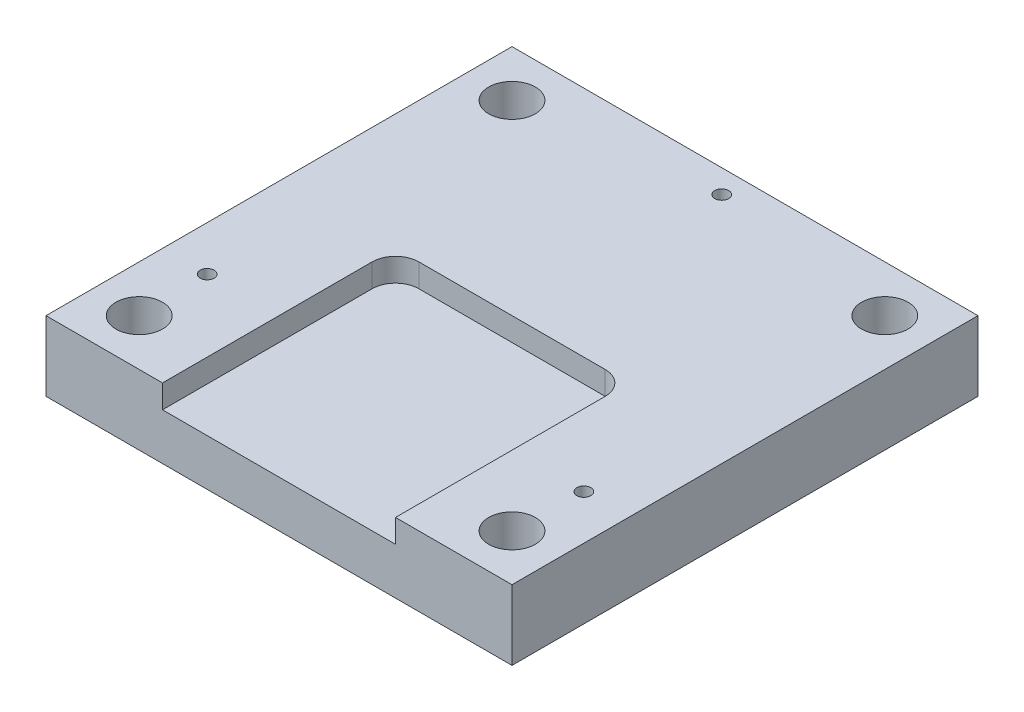
ISO-10303-21;
HEADER;
FILE_DESCRIPTION(('STEP AP214'),'2;1');
FILE_NAME('part.step','',(''),(''),'','','');
FILE_SCHEMA(('AUTOMOTIVE_DESIGN { 1 0 10303 214 1 1 1 1 }'));
ENDSEC;
DATA;
#1=APPLICATION_CONTEXT('core data for automotive mechanical design processes');
#2=APPLICATION_PROTOCOL_DEFINITION('international standard','automotive_design',2000,#1);
#3=PRODUCT_CONTEXT('',#1,'mechanical');
#4=PRODUCT('Part','Part','',(#3));
#5=PRODUCT_RELATED_PRODUCT_CATEGORY('part','',(#4));
#6=PRODUCT_DEFINITION_FORMATION('','',#4);
#7=PRODUCT_DEFINITION_CONTEXT('part definition',#1,'design');
#8=PRODUCT_DEFINITION('design','',#6,#7);
#9=PRODUCT_DEFINITION_SHAPE('','',#8);
#10=(LENGTH_UNIT() NAMED_UNIT(*) SI_UNIT(.MILLI.,.METRE.));
#11=(NAMED_UNIT(*) PLANE_ANGLE_UNIT() SI_UNIT($,.RADIAN.));
#12=(NAMED_UNIT(*) SI_UNIT($,.STERADIAN.) SOLID_ANGLE_UNIT());
#13=UNCERTAINTY_MEASURE_WITH_UNIT(LENGTH_MEASURE(1.E-05),#10,'distance_accuracy_value','');
#14=(GEOMETRIC_REPRESENTATION_CONTEXT(3) GLOBAL_UNCERTAINTY_ASSIGNED_CONTEXT((#13)) GLOBAL_UNIT_ASSIGNED_CONTEXT((#10,
#11,#12)) REPRESENTATION_CONTEXT('',''));
#15=CARTESIAN_POINT('',(0.,0.,0.));
#16=DIRECTION('',(0.,0.,1.));
#17=DIRECTION('',(1.,0.,0.));
#18=AXIS2_PLACEMENT_3D('',#15,#16,#17);
#19=CARTESIAN_POINT('',(0.,15.,0.));
#20=DIRECTION('',(1.,0.,0.));
#21=DIRECTION('',(0.,0.,-1.));
#22=AXIS2_PLACEMENT_3D('',#19,#20,#21);
#23=PLANE('',#22);
#24=DIRECTION('',(0.,0.,1.));
#25=VECTOR('',#24,1.);
#26=CARTESIAN_POINT('',(0.,0.,0.));
#27=LINE('',#26,#25);
#28=CARTESIAN_POINT('',(0.,0.,0.));
#29=VERTEX_POINT('',#28);
#30=CARTESIAN_POINT('',(0.,0.,100.));
#31=VERTEX_POINT('',#30);
#32=EDGE_CURVE('E149',#29,#31,#27,.T.);
#33=ORIENTED_EDGE('',*,*,#32,.T.);
#34=DIRECTION('',(0.,-1.,0.));
#35=VECTOR('',#34,1.);
#36=CARTESIAN_POINT('',(0.,15.,100.));
#37=LINE('',#36,#35);
#38=CARTESIAN_POINT('',(0.,15.,100.));
#39=VERTEX_POINT('',#38);
#40=EDGE_CURVE('E191',#39,#31,#37,.T.);
#41=ORIENTED_EDGE('',*,*,#40,.F.);
#42=DIRECTION('',(0.,0.,1.));
#43=VECTOR('',#42,1.);
#44=CARTESIAN_POINT('',(0.,15.,0.));
#45=LINE('',#44,#43);
#46=CARTESIAN_POINT('',(0.,15.,0.));
#47=VERTEX_POINT('',#46);
#48=EDGE_CURVE('E164',#47,#39,#45,.T.);
#49=ORIENTED_EDGE('',*,*,#48,.F.);
#50=DIRECTION('',(0.,-1.,0.));
#51=VECTOR('',#50,1.);
#52=CARTESIAN_POINT('',(0.,15.,0.));
#53=LINE('',#52,#51);
#54=EDGE_CURVE('E175',#47,#29,#53,.T.);
#55=ORIENTED_EDGE('',*,*,#54,.T.);
#56=EDGE_LOOP('',(#33,#41,#49,#55));
#57=FACE_BOUND('',#56,.T.);
#58=ADVANCED_FACE('F34',(#57),#23,.F.);
#59=CARTESIAN_POINT('',(0.,15.,100.));
#60=DIRECTION('',(0.,0.,-1.));
#61=DIRECTION('',(-1.,0.,0.));
#62=AXIS2_PLACEMENT_3D('',#59,#60,#61);
#63=PLANE('',#62);
#64=DIRECTION('',(1.,0.,0.));
#65=VECTOR('',#64,1.);
#66=CARTESIAN_POINT('',(25.,10.,100.));
#67=LINE('',#66,#65);
#68=CARTESIAN_POINT('',(25.,10.,100.));
#69=VERTEX_POINT('',#68);
#70=CARTESIAN_POINT('',(75.,10.,100.));
#71=VERTEX_POINT('',#70);
#72=EDGE_CURVE('E114',#69,#71,#67,.T.);
#73=ORIENTED_EDGE('',*,*,#72,.F.);
#74=DIRECTION('',(0.,1.,0.));
#75=VECTOR('',#74,1.);
#76=CARTESIAN_POINT('',(25.,10.,100.));
#77=LINE('',#76,#75);
#78=CARTESIAN_POINT('',(25.,15.,100.));
#79=VERTEX_POINT('',#78);
#80=EDGE_CURVE('E120',#69,#79,#77,.T.);
#81=ORIENTED_EDGE('',*,*,#80,.T.);
#82=DIRECTION('',(1.,0.,0.));
#83=VECTOR('',#82,1.);
#84=CARTESIAN_POINT('',(0.,15.,100.));
#85=LINE('',#84,#83);
#86=EDGE_CURVE('E169',#39,#79,#85,.T.);
#87=ORIENTED_EDGE('',*,*,#86,.F.);
#88=ORIENTED_EDGE('',*,*,#40,.T.);
#89=DIRECTION('',(1.,0.,0.));
#90=VECTOR('',#89,1.);
#91=CARTESIAN_POINT('',(0.,0.,100.));
#92=LINE('',#91,#90);
#93=CARTESIAN_POINT('',(100.,0.,100.));
#94=VERTEX_POINT('',#93);
#95=EDGE_CURVE('E178',#31,#94,#92,.T.);
#96=ORIENTED_EDGE('',*,*,#95,.T.);
#97=DIRECTION('',(0.,-1.,0.));
#98=VECTOR('',#97,1.);
#99=CARTESIAN_POINT('',(100.,15.,100.));
#100=LINE('',#99,#98);
#101=CARTESIAN_POINT('',(100.,15.,100.));
#102=VERTEX_POINT('',#101);
#103=EDGE_CURVE('E188',#102,#94,#100,.T.);
#104=ORIENTED_EDGE('',*,*,#103,.F.);
#105=CARTESIAN_POINT('',(75.,15.,100.));
#106=VERTEX_POINT('',#105);
#107=EDGE_CURVE('E167',#106,#102,#85,.T.);
#108=ORIENTED_EDGE('',*,*,#107,.F.);
#109=DIRECTION('',(0.,1.,0.));
#110=VECTOR('',#109,1.);
#111=CARTESIAN_POINT('',(75.,10.,100.));
#112=LINE('',#111,#110);
#113=EDGE_CURVE('E126',#71,#106,#112,.T.);
#114=ORIENTED_EDGE('',*,*,#113,.F.);
#115=EDGE_LOOP('',(#73,#81,#87,#88,#96,#104,#108,#114));
#116=FACE_BOUND('',#115,.T.);
#117=ADVANCED_FACE('F129',(#116),#63,.F.);
#118=CARTESIAN_POINT('',(100.,15.,0.));
#119=DIRECTION('',(-1.,0.,0.));
#120=DIRECTION('',(0.,0.,1.));
#121=AXIS2_PLACEMENT_3D('',#118,#119,#120);
#122=PLANE('',#121);
#123=DIRECTION('',(0.,0.,-1.));
#124=VECTOR('',#123,1.);
#125=CARTESIAN_POINT('',(100.,0.,0.));
#126=LINE('',#125,#124);
#127=CARTESIAN_POINT('',(100.,0.,0.));
#128=VERTEX_POINT('',#127);
#129=EDGE_CURVE('E180',#94,#128,#126,.T.);
#130=ORIENTED_EDGE('',*,*,#129,.T.);
#131=DIRECTION('',(0.,-1.,0.));
#132=VECTOR('',#131,1.);
#133=CARTESIAN_POINT('',(100.,15.,0.));
#134=LINE('',#133,#132);
#135=CARTESIAN_POINT('',(100.,15.,0.));
#136=VERTEX_POINT('',#135);
#137=EDGE_CURVE('E185',#136,#128,#134,.T.);
#138=ORIENTED_EDGE('',*,*,#137,.F.);
#139=DIRECTION('',(0.,0.,-1.));
#140=VECTOR('',#139,1.);
#141=CARTESIAN_POINT('',(100.,15.,0.));
#142=LINE('',#141,#140);
#143=EDGE_CURVE('E171',#102,#136,#142,.T.);
#144=ORIENTED_EDGE('',*,*,#143,.F.);
#145=ORIENTED_EDGE('',*,*,#103,.T.);
#146=EDGE_LOOP('',(#130,#138,#144,#145));
#147=FACE_BOUND('',#146,.T.);
#148=ADVANCED_FACE('F232',(#147),#122,.F.);
#149=CARTESIAN_POINT('',(0.,15.,0.));
#150=DIRECTION('',(0.,0.,1.));
#151=DIRECTION('',(1.,0.,0.));
#152=AXIS2_PLACEMENT_3D('',#149,#150,#151);
#153=PLANE('',#152);
#154=DIRECTION('',(-1.,0.,0.));
#155=VECTOR('',#154,1.);
#156=CARTESIAN_POINT('',(0.,0.,0.));
#157=LINE('',#156,#155);
#158=EDGE_CURVE('E168',#128,#29,#157,.T.);
#159=ORIENTED_EDGE('',*,*,#158,.T.);
#160=ORIENTED_EDGE('',*,*,#54,.F.);
#161=DIRECTION('',(-1.,0.,0.));
#162=VECTOR('',#161,1.);
#163=CARTESIAN_POINT('',(0.,15.,0.));
#164=LINE('',#163,#162);
#165=EDGE_CURVE('E173',#136,#47,#164,.T.);
#166=ORIENTED_EDGE('',*,*,#165,.F.);
#167=ORIENTED_EDGE('',*,*,#137,.T.);
#168=EDGE_LOOP('',(#159,#160,#166,#167));
#169=FACE_BOUND('',#168,.T.);
#170=ADVANCED_FACE('F236',(#169),#153,.F.);
#171=CARTESIAN_POINT('',(0.,15.,0.));
#172=DIRECTION('',(0.,1.,0.));
#173=DIRECTION('',(0.,0.,1.));
#174=AXIS2_PLACEMENT_3D('',#171,#172,#173);
#175=PLANE('',#174);
#176=CARTESIAN_POINT('',(90.,15.,9.99999999999996));
#177=DIRECTION('',(0.,1.,0.));
#178=DIRECTION('',(0.,0.,1.));
#179=AXIS2_PLACEMENT_3D('',#176,#177,#178);
#180=CIRCLE('',#179,5.);
#181=CARTESIAN_POINT('',(90.,15.,15.));
#182=VERTEX_POINT('',#181);
#183=EDGE_CURVE('E472',#182,#182,#180,.T.);
#184=ORIENTED_EDGE('',*,*,#183,.F.);
#185=EDGE_LOOP('',(#184));
#186=FACE_BOUND('',#185,.T.);
#187=CARTESIAN_POINT('',(9.99999999999999,15.,90.));
#188=DIRECTION('',(0.,1.,0.));
#189=DIRECTION('',(0.,0.,1.));
#190=AXIS2_PLACEMENT_3D('',#187,#188,#189);
#191=CIRCLE('',#190,5.);
#192=CARTESIAN_POINT('',(9.99999999999999,15.,95.));
#193=VERTEX_POINT('',#192);
#194=EDGE_CURVE('E460',#193,#193,#191,.T.);
#195=ORIENTED_EDGE('',*,*,#194,.F.);
#196=EDGE_LOOP('',(#195));
#197=FACE_BOUND('',#196,.T.);
#198=CARTESIAN_POINT('',(90.,15.,90.));
#199=DIRECTION('',(0.,1.,0.));
#200=DIRECTION('',(0.,0.,1.));
#201=AXIS2_PLACEMENT_3D('',#198,#199,#200);
#202=CIRCLE('',#201,5.00000000000001);
#203=CARTESIAN_POINT('',(90.,15.,95.));
#204=VERTEX_POINT('',#203);
#205=EDGE_CURVE('E461',#204,#204,#202,.T.);
#206=ORIENTED_EDGE('',*,*,#205,.F.);
#207=EDGE_LOOP('',(#206));
#208=FACE_BOUND('',#207,.T.);
#209=CARTESIAN_POINT('',(9.99999999999996,15.,10.));
#210=DIRECTION('',(0.,1.,0.));
#211=DIRECTION('',(0.,0.,1.));
#212=AXIS2_PLACEMENT_3D('',#209,#210,#211);
#213=CIRCLE('',#212,5.);
#214=CARTESIAN_POINT('',(9.99999999999996,15.,15.));
#215=VERTEX_POINT('',#214);
#216=EDGE_CURVE('E471',#215,#215,#213,.T.);
#217=ORIENTED_EDGE('',*,*,#216,.F.);
#218=EDGE_LOOP('',(#217));
#219=FACE_BOUND('',#218,.T.);
#220=DIRECTION('',(0.,0.,1.));
#221=VECTOR('',#220,1.);
#222=CARTESIAN_POINT('',(25.,15.,50.));
#223=LINE('',#222,#221);
#224=CARTESIAN_POINT('',(25.,15.,55.));
#225=VERTEX_POINT('',#224);
#226=EDGE_CURVE('E123',#225,#79,#223,.T.);
#227=ORIENTED_EDGE('',*,*,#226,.F.);
#228=CARTESIAN_POINT('',(30.,15.,55.));
#229=DIRECTION('',(0.,1.,0.));
#230=DIRECTION('',(0.,0.,1.));
#231=AXIS2_PLACEMENT_3D('',#228,#229,#230);
#232=CIRCLE('',#231,5.);
#233=CARTESIAN_POINT('',(30.,15.,50.));
#234=VERTEX_POINT('',#233);
#235=EDGE_CURVE('E11',#225,#234,#232,.F.);
#236=ORIENTED_EDGE('',*,*,#235,.T.);
#237=DIRECTION('',(-1.,0.,0.));
#238=VECTOR('',#237,1.);
#239=CARTESIAN_POINT('',(25.,15.,50.));
#240=LINE('',#239,#238);
#241=CARTESIAN_POINT('',(70.,15.,50.));
#242=VERTEX_POINT('',#241);
#243=EDGE_CURVE('E117',#242,#234,#240,.T.);
#244=ORIENTED_EDGE('',*,*,#243,.F.);
#245=CARTESIAN_POINT('',(70.,15.,55.));
#246=DIRECTION('',(0.,1.,0.));
#247=DIRECTION('',(0.,0.,1.));
#248=AXIS2_PLACEMENT_3D('',#245,#246,#247);
#249=CIRCLE('',#248,5.);
#250=CARTESIAN_POINT('',(75.,15.,55.));
#251=VERTEX_POINT('',#250);
#252=EDGE_CURVE('E42',#242,#251,#249,.F.);
#253=ORIENTED_EDGE('',*,*,#252,.T.);
#254=DIRECTION('',(0.,0.,-1.));
#255=VECTOR('',#254,1.);
#256=CARTESIAN_POINT('',(75.,15.,50.));
#257=LINE('',#256,#255);
#258=EDGE_CURVE('E138',#106,#251,#257,.T.);
#259=ORIENTED_EDGE('',*,*,#258,.F.);
#260=ORIENTED_EDGE('',*,*,#107,.T.);
#261=ORIENTED_EDGE('',*,*,#143,.T.);
#262=ORIENTED_EDGE('',*,*,#165,.T.);
#263=ORIENTED_EDGE('',*,*,#48,.T.);
#264=ORIENTED_EDGE('',*,*,#86,.T.);
#265=EDGE_LOOP('',(#227,#236,#244,#253,#259,#260,#261,#262,#263,#264));
#266=FACE_BOUND('',#265,.T.);
#267=CARTESIAN_POINT('',(50.,15.,5.));
#268=DIRECTION('',(0.,1.,0.));
#269=DIRECTION('',(0.,0.,1.));
#270=AXIS2_PLACEMENT_3D('',#267,#268,#269);
#271=CIRCLE('',#270,1.5);
#272=CARTESIAN_POINT('',(50.,15.,6.50000000000001));
#273=VERTEX_POINT('',#272);
#274=EDGE_CURVE('E150',#273,#273,#271,.T.);
#275=ORIENTED_EDGE('',*,*,#274,.F.);
#276=EDGE_LOOP('',(#275));
#277=FACE_BOUND('',#276,.T.);
#278=CARTESIAN_POINT('',(9.5854811567262,15.,75.));
#279=DIRECTION('',(0.,1.,0.));
#280=DIRECTION('',(0.,0.,1.));
#281=AXIS2_PLACEMENT_3D('',#278,#279,#280);
#282=CIRCLE('',#281,1.5);
#283=CARTESIAN_POINT('',(9.5854811567262,15.,76.5));
#284=VERTEX_POINT('',#283);
#285=EDGE_CURVE('E156',#284,#284,#282,.T.);
#286=ORIENTED_EDGE('',*,*,#285,.F.);
#287=EDGE_LOOP('',(#286));
#288=FACE_BOUND('',#287,.T.);
#289=CARTESIAN_POINT('',(90.4145188432738,15.,75.));
#290=DIRECTION('',(0.,1.,0.));
#291=DIRECTION('',(0.,0.,1.));
#292=AXIS2_PLACEMENT_3D('',#289,#290,#291);
#293=CIRCLE('',#292,1.5);
#294=CARTESIAN_POINT('',(90.4145188432738,15.,76.5));
#295=VERTEX_POINT('',#294);
#296=EDGE_CURVE('E144',#295,#295,#293,.T.);
#297=ORIENTED_EDGE('',*,*,#296,.F.);
#298=EDGE_LOOP('',(#297));
#299=FACE_BOUND('',#298,.T.);
#300=ADVANCED_FACE('F208',(#186,#197,#208,#219,#266,#277,#288,#299),#175,.T.);
#301=CARTESIAN_POINT('',(0.,0.,0.));
#302=DIRECTION('',(0.,1.,0.));
#303=DIRECTION('',(0.,0.,1.));
#304=AXIS2_PLACEMENT_3D('',#301,#302,#303);
#305=PLANE('',#304);
#306=CARTESIAN_POINT('',(50.,0.,5.));
#307=DIRECTION('',(0.,1.,0.));
#308=DIRECTION('',(0.,0.,1.));
#309=AXIS2_PLACEMENT_3D('',#306,#307,#308);
#310=CIRCLE('',#309,1.5);
#311=CARTESIAN_POINT('',(50.,0.,6.50000000000001));
#312=VERTEX_POINT('',#311);
#313=EDGE_CURVE('E146',#312,#312,#310,.T.);
#314=ORIENTED_EDGE('',*,*,#313,.T.);
#315=EDGE_LOOP('',(#314));
#316=FACE_BOUND('',#315,.T.);
#317=CARTESIAN_POINT('',(9.5854811567262,0.,75.));
#318=DIRECTION('',(0.,1.,0.));
#319=DIRECTION('',(0.,0.,1.));
#320=AXIS2_PLACEMENT_3D('',#317,#318,#319);
#321=CIRCLE('',#320,1.5);
#322=CARTESIAN_POINT('',(9.5854811567262,0.,76.5));
#323=VERTEX_POINT('',#322);
#324=EDGE_CURVE('E153',#323,#323,#321,.T.);
#325=ORIENTED_EDGE('',*,*,#324,.T.);
#326=EDGE_LOOP('',(#325));
#327=FACE_BOUND('',#326,.T.);
#328=CARTESIAN_POINT('',(90.4145188432738,0.,75.));
#329=DIRECTION('',(0.,1.,0.));
#330=DIRECTION('',(0.,0.,1.));
#331=AXIS2_PLACEMENT_3D('',#328,#329,#330);
#332=CIRCLE('',#331,1.5);
#333=CARTESIAN_POINT('',(90.4145188432738,0.,76.5));
#334=VERTEX_POINT('',#333);
#335=EDGE_CURVE('E159',#334,#334,#332,.T.);
#336=ORIENTED_EDGE('',*,*,#335,.T.);
#337=EDGE_LOOP('',(#336));
#338=FACE_BOUND('',#337,.T.);
#339=ORIENTED_EDGE('',*,*,#32,.F.);
#340=ORIENTED_EDGE('',*,*,#158,.F.);
#341=ORIENTED_EDGE('',*,*,#129,.F.);
#342=ORIENTED_EDGE('',*,*,#95,.F.);
#343=EDGE_LOOP('',(#339,#340,#341,#342));
#344=FACE_BOUND('',#343,.T.);
#345=ADVANCED_FACE('F228',(#316,#327,#338,#344),#305,.F.);
#346=CARTESIAN_POINT('',(90.4145188432738,0.,75.));
#347=DIRECTION('',(0.,1.,0.));
#348=DIRECTION('',(0.,0.,1.));
#349=AXIS2_PLACEMENT_3D('',#346,#347,#348);
#350=CYLINDRICAL_SURFACE('',#349,1.5);
#351=ORIENTED_EDGE('',*,*,#335,.F.);
#352=EDGE_LOOP('',(#351));
#353=FACE_BOUND('',#352,.T.);
#354=ORIENTED_EDGE('',*,*,#296,.T.);
#355=EDGE_LOOP('',(#354));
#356=FACE_BOUND('',#355,.T.);
#357=ADVANCED_FACE('F304',(#353,#356),#350,.F.);
#358=CARTESIAN_POINT('',(9.5854811567262,0.,75.));
#359=DIRECTION('',(0.,1.,0.));
#360=DIRECTION('',(0.,0.,1.));
#361=AXIS2_PLACEMENT_3D('',#358,#359,#360);
#362=CYLINDRICAL_SURFACE('',#361,1.5);
#363=ORIENTED_EDGE('',*,*,#324,.F.);
#364=EDGE_LOOP('',(#363));
#365=FACE_BOUND('',#364,.T.);
#366=ORIENTED_EDGE('',*,*,#285,.T.);
#367=EDGE_LOOP('',(#366));
#368=FACE_BOUND('',#367,.T.);
#369=ADVANCED_FACE('F300',(#365,#368),#362,.F.);
#370=CARTESIAN_POINT('',(50.,0.,5.));
#371=DIRECTION('',(0.,1.,0.));
#372=DIRECTION('',(0.,0.,1.));
#373=AXIS2_PLACEMENT_3D('',#370,#371,#372);
#374=CYLINDRICAL_SURFACE('',#373,1.5);
#375=ORIENTED_EDGE('',*,*,#313,.F.);
#376=EDGE_LOOP('',(#375));
#377=FACE_BOUND('',#376,.T.);
#378=ORIENTED_EDGE('',*,*,#274,.T.);
#379=EDGE_LOOP('',(#378));
#380=FACE_BOUND('',#379,.T.);
#381=ADVANCED_FACE('F297',(#377,#380),#374,.F.);
#382=CARTESIAN_POINT('',(25.,10.,50.));
#383=DIRECTION('',(-1.,0.,0.));
#384=DIRECTION('',(0.,0.,1.));
#385=AXIS2_PLACEMENT_3D('',#382,#383,#384);
#386=PLANE('',#385);
#387=DIRECTION('',(0.,0.,1.));
#388=VECTOR('',#387,1.);
#389=CARTESIAN_POINT('',(25.,10.,50.));
#390=LINE('',#389,#388);
#391=CARTESIAN_POINT('',(25.,10.,55.));
#392=VERTEX_POINT('',#391);
#393=EDGE_CURVE('E109',#392,#69,#390,.T.);
#394=ORIENTED_EDGE('',*,*,#393,.F.);
#395=DIRECTION('',(0.,1.,0.));
#396=VECTOR('',#395,1.);
#397=CARTESIAN_POINT('',(25.,15.,55.));
#398=LINE('',#397,#396);
#399=EDGE_CURVE('E204',#392,#225,#398,.T.);
#400=ORIENTED_EDGE('',*,*,#399,.T.);
#401=ORIENTED_EDGE('',*,*,#226,.T.);
#402=ORIENTED_EDGE('',*,*,#80,.F.);
#403=EDGE_LOOP('',(#394,#400,#401,#402));
#404=FACE_BOUND('',#403,.T.);
#405=ADVANCED_FACE('F121',(#404),#386,.F.);
#406=CARTESIAN_POINT('',(25.,10.,50.));
#407=DIRECTION('',(0.,0.,-1.));
#408=DIRECTION('',(-1.,0.,0.));
#409=AXIS2_PLACEMENT_3D('',#406,#407,#408);
#410=PLANE('',#409);
#411=DIRECTION('',(-1.,0.,0.));
#412=VECTOR('',#411,1.);
#413=CARTESIAN_POINT('',(25.,10.,50.));
#414=LINE('',#413,#412);
#415=CARTESIAN_POINT('',(70.,10.,50.));
#416=VERTEX_POINT('',#415);
#417=CARTESIAN_POINT('',(30.,10.,50.));
#418=VERTEX_POINT('',#417);
#419=EDGE_CURVE('E127',#416,#418,#414,.T.);
#420=ORIENTED_EDGE('',*,*,#419,.F.);
#421=DIRECTION('',(0.,1.,0.));
#422=VECTOR('',#421,1.);
#423=CARTESIAN_POINT('',(70.,15.,50.));
#424=LINE('',#423,#422);
#425=EDGE_CURVE('E196',#416,#242,#424,.T.);
#426=ORIENTED_EDGE('',*,*,#425,.T.);
#427=ORIENTED_EDGE('',*,*,#243,.T.);
#428=DIRECTION('',(0.,1.,0.));
#429=VECTOR('',#428,1.);
#430=CARTESIAN_POINT('',(30.,10.,50.));
#431=LINE('',#430,#429);
#432=EDGE_CURVE('E194',#234,#418,#431,.F.);
#433=ORIENTED_EDGE('',*,*,#432,.T.);
#434=EDGE_LOOP('',(#420,#426,#427,#433));
#435=FACE_BOUND('',#434,.T.);
#436=ADVANCED_FACE('F219',(#435),#410,.F.);
#437=CARTESIAN_POINT('',(75.,10.,50.));
#438=DIRECTION('',(1.,0.,0.));
#439=DIRECTION('',(0.,0.,-1.));
#440=AXIS2_PLACEMENT_3D('',#437,#438,#439);
#441=PLANE('',#440);
#442=ORIENTED_EDGE('',*,*,#258,.T.);
#443=DIRECTION('',(0.,1.,0.));
#444=VECTOR('',#443,1.);
#445=CARTESIAN_POINT('',(75.,10.,55.));
#446=LINE('',#445,#444);
#447=CARTESIAN_POINT('',(75.,10.,55.));
#448=VERTEX_POINT('',#447);
#449=EDGE_CURVE('E199',#251,#448,#446,.F.);
#450=ORIENTED_EDGE('',*,*,#449,.T.);
#451=DIRECTION('',(0.,0.,-1.));
#452=VECTOR('',#451,1.);
#453=CARTESIAN_POINT('',(75.,10.,50.));
#454=LINE('',#453,#452);
#455=EDGE_CURVE('E131',#71,#448,#454,.T.);
#456=ORIENTED_EDGE('',*,*,#455,.F.);
#457=ORIENTED_EDGE('',*,*,#113,.T.);
#458=EDGE_LOOP('',(#442,#450,#456,#457));
#459=FACE_BOUND('',#458,.T.);
#460=ADVANCED_FACE('F214',(#459),#441,.F.);
#461=CARTESIAN_POINT('',(0.,10.,0.));
#462=DIRECTION('',(0.,1.,0.));
#463=DIRECTION('',(0.,0.,1.));
#464=AXIS2_PLACEMENT_3D('',#461,#462,#463);
#465=PLANE('',#464);
#466=ORIENTED_EDGE('',*,*,#455,.T.);
#467=CARTESIAN_POINT('',(70.,10.,55.));
#468=DIRECTION('',(0.,1.,0.));
#469=DIRECTION('',(0.,0.,1.));
#470=AXIS2_PLACEMENT_3D('',#467,#468,#469);
#471=CIRCLE('',#470,5.);
#472=EDGE_CURVE('E202',#448,#416,#471,.T.);
#473=ORIENTED_EDGE('',*,*,#472,.T.);
#474=ORIENTED_EDGE('',*,*,#419,.T.);
#475=CARTESIAN_POINT('',(30.,10.,55.));
#476=DIRECTION('',(0.,1.,0.));
#477=DIRECTION('',(0.,0.,1.));
#478=AXIS2_PLACEMENT_3D('',#475,#476,#477);
#479=CIRCLE('',#478,5.);
#480=EDGE_CURVE('E55',#418,#392,#479,.T.);
#481=ORIENTED_EDGE('',*,*,#480,.T.);
#482=ORIENTED_EDGE('',*,*,#393,.T.);
#483=ORIENTED_EDGE('',*,*,#72,.T.);
#484=EDGE_LOOP('',(#466,#473,#474,#481,#482,#483));
#485=FACE_BOUND('',#484,.T.);
#486=ADVANCED_FACE('F112',(#485),#465,.T.);
#487=CARTESIAN_POINT('',(9.99999999999996,5.,10.));
#488=DIRECTION('',(0.,1.,0.));
#489=DIRECTION('',(0.,0.,1.));
#490=AXIS2_PLACEMENT_3D('',#487,#488,#489);
#491=CYLINDRICAL_SURFACE('',#490,5.);
#492=CARTESIAN_POINT('',(9.99999999999996,5.,10.));
#493=DIRECTION('',(0.,1.,0.));
#494=DIRECTION('',(0.,0.,1.));
#495=AXIS2_PLACEMENT_3D('',#492,#493,#494);
#496=CIRCLE('',#495,5.);
#497=CARTESIAN_POINT('',(9.99999999999996,5.,15.));
#498=VERTEX_POINT('',#497);
#499=EDGE_CURVE('E139',#498,#498,#496,.T.);
#500=ORIENTED_EDGE('',*,*,#499,.F.);
#501=EDGE_LOOP('',(#500));
#502=FACE_BOUND('',#501,.T.);
#503=ORIENTED_EDGE('',*,*,#216,.T.);
#504=EDGE_LOOP('',(#503));
#505=FACE_BOUND('',#504,.T.);
#506=ADVANCED_FACE('F284',(#502,#505),#491,.F.);
#507=CARTESIAN_POINT('',(9.99999999999996,5.,10.));
#508=DIRECTION('',(0.,1.,0.));
#509=DIRECTION('',(0.,0.,1.));
#510=AXIS2_PLACEMENT_3D('',#507,#508,#509);
#511=PLANE('',#510);
#512=ORIENTED_EDGE('',*,*,#499,.T.);
#513=EDGE_LOOP('',(#512));
#514=FACE_BOUND('',#513,.T.);
#515=ADVANCED_FACE('F281',(#514),#511,.T.);
#516=CARTESIAN_POINT('',(90.,5.,90.));
#517=DIRECTION('',(0.,1.,0.));
#518=DIRECTION('',(0.,0.,1.));
#519=AXIS2_PLACEMENT_3D('',#516,#517,#518);
#520=CYLINDRICAL_SURFACE('',#519,5.00000000000001);
#521=CARTESIAN_POINT('',(90.,5.,90.));
#522=DIRECTION('',(0.,1.,0.));
#523=DIRECTION('',(0.,0.,1.));
#524=AXIS2_PLACEMENT_3D('',#521,#522,#523);
#525=CIRCLE('',#524,5.00000000000001);
#526=CARTESIAN_POINT('',(90.,5.,95.));
#527=VERTEX_POINT('',#526);
#528=EDGE_CURVE('E459',#527,#527,#525,.T.);
#529=ORIENTED_EDGE('',*,*,#528,.F.);
#530=EDGE_LOOP('',(#529));
#531=FACE_BOUND('',#530,.T.);
#532=ORIENTED_EDGE('',*,*,#205,.T.);
#533=EDGE_LOOP('',(#532));
#534=FACE_BOUND('',#533,.T.);
#535=ADVANCED_FACE('F270',(#531,#534),#520,.F.);
#536=CARTESIAN_POINT('',(90.,5.,90.));
#537=DIRECTION('',(0.,1.,0.));
#538=DIRECTION('',(0.,0.,1.));
#539=AXIS2_PLACEMENT_3D('',#536,#537,#538);
#540=PLANE('',#539);
#541=ORIENTED_EDGE('',*,*,#528,.T.);
#542=EDGE_LOOP('',(#541));
#543=FACE_BOUND('',#542,.T.);
#544=ADVANCED_FACE('F279',(#543),#540,.T.);
#545=CARTESIAN_POINT('',(9.99999999999999,5.,90.));
#546=DIRECTION('',(0.,1.,0.));
#547=DIRECTION('',(0.,0.,1.));
#548=AXIS2_PLACEMENT_3D('',#545,#546,#547);
#549=CYLINDRICAL_SURFACE('',#548,5.);
#550=CARTESIAN_POINT('',(9.99999999999999,5.,90.));
#551=DIRECTION('',(0.,1.,0.));
#552=DIRECTION('',(0.,0.,1.));
#553=AXIS2_PLACEMENT_3D('',#550,#551,#552);
#554=CIRCLE('',#553,5.);
#555=CARTESIAN_POINT('',(9.99999999999999,5.,95.));
#556=VERTEX_POINT('',#555);
#557=EDGE_CURVE('E464',#556,#556,#554,.T.);
#558=ORIENTED_EDGE('',*,*,#557,.F.);
#559=EDGE_LOOP('',(#558));
#560=FACE_BOUND('',#559,.T.);
#561=ORIENTED_EDGE('',*,*,#194,.T.);
#562=EDGE_LOOP('',(#561));
#563=FACE_BOUND('',#562,.T.);
#564=ADVANCED_FACE('F275',(#560,#563),#549,.F.);
#565=CARTESIAN_POINT('',(9.99999999999999,5.,90.));
#566=DIRECTION('',(0.,1.,0.));
#567=DIRECTION('',(0.,0.,1.));
#568=AXIS2_PLACEMENT_3D('',#565,#566,#567);
#569=PLANE('',#568);
#570=ORIENTED_EDGE('',*,*,#557,.T.);
#571=EDGE_LOOP('',(#570));
#572=FACE_BOUND('',#571,.T.);
#573=ADVANCED_FACE('F265',(#572),#569,.T.);
#574=CARTESIAN_POINT('',(90.,5.,9.99999999999996));
#575=DIRECTION('',(0.,1.,0.));
#576=DIRECTION('',(0.,0.,1.));
#577=AXIS2_PLACEMENT_3D('',#574,#575,#576);
#578=CYLINDRICAL_SURFACE('',#577,5.);
#579=CARTESIAN_POINT('',(90.,5.,9.99999999999996));
#580=DIRECTION('',(0.,1.,0.));
#581=DIRECTION('',(0.,0.,1.));
#582=AXIS2_PLACEMENT_3D('',#579,#580,#581);
#583=CIRCLE('',#582,5.);
#584=CARTESIAN_POINT('',(90.,5.,15.));
#585=VERTEX_POINT('',#584);
#586=EDGE_CURVE('E469',#585,#585,#583,.T.);
#587=ORIENTED_EDGE('',*,*,#586,.F.);
#588=EDGE_LOOP('',(#587));
#589=FACE_BOUND('',#588,.T.);
#590=ORIENTED_EDGE('',*,*,#183,.T.);
#591=EDGE_LOOP('',(#590));
#592=FACE_BOUND('',#591,.T.);
#593=ADVANCED_FACE('F259',(#589,#592),#578,.F.);
#594=CARTESIAN_POINT('',(90.,5.,9.99999999999996));
#595=DIRECTION('',(0.,1.,0.));
#596=DIRECTION('',(0.,0.,1.));
#597=AXIS2_PLACEMENT_3D('',#594,#595,#596);
#598=PLANE('',#597);
#599=ORIENTED_EDGE('',*,*,#586,.T.);
#600=EDGE_LOOP('',(#599));
#601=FACE_BOUND('',#600,.T.);
#602=ADVANCED_FACE('F254',(#601),#598,.T.);
#603=CARTESIAN_POINT('',(70.,10.,55.));
#604=DIRECTION('',(0.,-1.,0.));
#605=DIRECTION('',(0.,0.,-1.));
#606=AXIS2_PLACEMENT_3D('',#603,#604,#605);
#607=CYLINDRICAL_SURFACE('',#606,5.);
#608=ORIENTED_EDGE('',*,*,#472,.F.);
#609=ORIENTED_EDGE('',*,*,#449,.F.);
#610=ORIENTED_EDGE('',*,*,#252,.F.);
#611=ORIENTED_EDGE('',*,*,#425,.F.);
#612=EDGE_LOOP('',(#608,#609,#610,#611));
#613=FACE_BOUND('',#612,.T.);
#614=ADVANCED_FACE('F216',(#613),#607,.F.);
#615=CARTESIAN_POINT('',(30.,10.,55.));
#616=DIRECTION('',(0.,-1.,0.));
#617=DIRECTION('',(0.,0.,-1.));
#618=AXIS2_PLACEMENT_3D('',#615,#616,#617);
#619=CYLINDRICAL_SURFACE('',#618,5.);
#620=ORIENTED_EDGE('',*,*,#480,.F.);
#621=ORIENTED_EDGE('',*,*,#432,.F.);
#622=ORIENTED_EDGE('',*,*,#235,.F.);
#623=ORIENTED_EDGE('',*,*,#399,.F.);
#624=EDGE_LOOP('',(#620,#621,#622,#623));
#625=FACE_BOUND('',#624,.T.);
#626=ADVANCED_FACE('F36',(#625),#619,.F.);
#627=CLOSED_SHELL('',(#58,#117,#148,#170,#300,#345,#357,#369,#381,#405,#436,#460,#486,#506,#515,
#535,#544,#564,#573,#593,#602,#614,#626));
#628=MANIFOLD_SOLID_BREP('B2',#627);
#629=ADVANCED_BREP_SHAPE_REPRESENTATION('',(#18,#628),#14);
#630=SHAPE_DEFINITION_REPRESENTATION(#9,#629);
ENDSEC;
END-ISO-10303-21;
